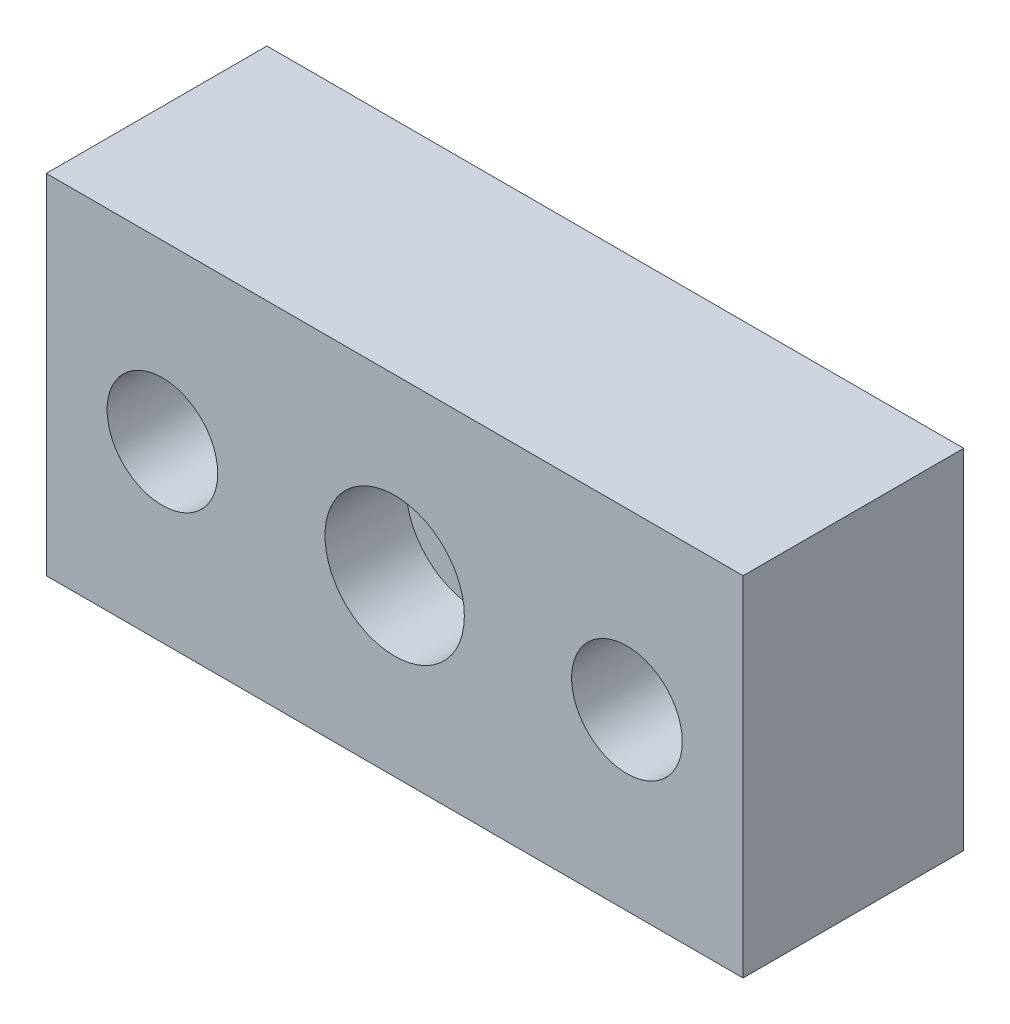
ISO-10303-21;
HEADER;
FILE_DESCRIPTION(('STEP AP214'),'2;1');
FILE_NAME('part.step','',(''),(''),'','','');
FILE_SCHEMA(('AUTOMOTIVE_DESIGN { 1 0 10303 214 1 1 1 1 }'));
ENDSEC;
DATA;
#1=APPLICATION_CONTEXT('core data for automotive mechanical design processes');
#2=APPLICATION_PROTOCOL_DEFINITION('international standard','automotive_design',2000,#1);
#3=PRODUCT_CONTEXT('',#1,'mechanical');
#4=PRODUCT('Part','Part','',(#3));
#5=PRODUCT_RELATED_PRODUCT_CATEGORY('part','',(#4));
#6=PRODUCT_DEFINITION_FORMATION('','',#4);
#7=PRODUCT_DEFINITION_CONTEXT('part definition',#1,'design');
#8=PRODUCT_DEFINITION('design','',#6,#7);
#9=PRODUCT_DEFINITION_SHAPE('','',#8);
#10=(LENGTH_UNIT() NAMED_UNIT(*) SI_UNIT(.MILLI.,.METRE.));
#11=(NAMED_UNIT(*) PLANE_ANGLE_UNIT() SI_UNIT($,.RADIAN.));
#12=(NAMED_UNIT(*) SI_UNIT($,.STERADIAN.) SOLID_ANGLE_UNIT());
#13=UNCERTAINTY_MEASURE_WITH_UNIT(LENGTH_MEASURE(1.E-05),#10,'distance_accuracy_value','');
#14=(GEOMETRIC_REPRESENTATION_CONTEXT(3) GLOBAL_UNCERTAINTY_ASSIGNED_CONTEXT((#13)) GLOBAL_UNIT_ASSIGNED_CONTEXT((#10,
#11,#12)) REPRESENTATION_CONTEXT('',''));
#15=CARTESIAN_POINT('',(0.,0.,0.));
#16=DIRECTION('',(0.,0.,1.));
#17=DIRECTION('',(1.,0.,0.));
#18=AXIS2_PLACEMENT_3D('',#15,#16,#17);
#19=CARTESIAN_POINT('',(0.,0.,9.5));
#20=DIRECTION('',(0.,0.,-1.));
#21=DIRECTION('',(-1.,0.,0.));
#22=AXIS2_PLACEMENT_3D('',#19,#20,#21);
#23=CYLINDRICAL_SURFACE('',#22,1.);
#24=CARTESIAN_POINT('',(0.,0.,6.));
#25=DIRECTION('',(0.,0.,1.));
#26=DIRECTION('',(1.,0.,0.));
#27=AXIS2_PLACEMENT_3D('',#24,#25,#26);
#28=CIRCLE('',#27,1.);
#29=CARTESIAN_POINT('',(0.999999999999993,0.,6.));
#30=VERTEX_POINT('',#29);
#31=EDGE_CURVE('E126',#30,#30,#28,.T.);
#32=ORIENTED_EDGE('',*,*,#31,.T.);
#33=EDGE_LOOP('',(#32));
#34=FACE_BOUND('',#33,.T.);
#35=CARTESIAN_POINT('',(0.,0.,3.));
#36=DIRECTION('',(0.,0.,-1.));
#37=DIRECTION('',(-1.,0.,0.));
#38=AXIS2_PLACEMENT_3D('',#35,#36,#37);
#39=CIRCLE('',#38,1.);
#40=CARTESIAN_POINT('',(-1.00000000000001,0.,3.));
#41=VERTEX_POINT('',#40);
#42=EDGE_CURVE('E43',#41,#41,#39,.T.);
#43=ORIENTED_EDGE('',*,*,#42,.T.);
#44=EDGE_LOOP('',(#43));
#45=FACE_BOUND('',#44,.T.);
#46=ADVANCED_FACE('F39',(#34,#45),#23,.F.);
#47=CARTESIAN_POINT('',(0.,0.,9.5));
#48=DIRECTION('',(0.,0.,-1.));
#49=DIRECTION('',(-1.,0.,0.));
#50=AXIS2_PLACEMENT_3D('',#47,#48,#49);
#51=PLANE('',#50);
#52=CARTESIAN_POINT('',(0.,0.,9.5));
#53=DIRECTION('',(0.,0.,1.));
#54=DIRECTION('',(1.,0.,0.));
#55=AXIS2_PLACEMENT_3D('',#52,#53,#54);
#56=CIRCLE('',#55,3.);
#57=CARTESIAN_POINT('',(3.,0.,9.5));
#58=VERTEX_POINT('',#57);
#59=EDGE_CURVE('E139',#58,#58,#56,.T.);
#60=ORIENTED_EDGE('',*,*,#59,.F.);
#61=EDGE_LOOP('',(#60));
#62=FACE_BOUND('',#61,.T.);
#63=DIRECTION('',(0.,1.,0.));
#64=VECTOR('',#63,1.);
#65=CARTESIAN_POINT('',(15.,-7.5,9.5));
#66=LINE('',#65,#64);
#67=CARTESIAN_POINT('',(15.,-7.5,9.5));
#68=VERTEX_POINT('',#67);
#69=CARTESIAN_POINT('',(15.,7.5,9.5));
#70=VERTEX_POINT('',#69);
#71=EDGE_CURVE('E95',#68,#70,#66,.T.);
#72=ORIENTED_EDGE('',*,*,#71,.T.);
#73=DIRECTION('',(-1.,0.,0.));
#74=VECTOR('',#73,1.);
#75=CARTESIAN_POINT('',(-15.,7.5,9.5));
#76=LINE('',#75,#74);
#77=CARTESIAN_POINT('',(-15.,7.5,9.5));
#78=VERTEX_POINT('',#77);
#79=EDGE_CURVE('E89',#70,#78,#76,.T.);
#80=ORIENTED_EDGE('',*,*,#79,.T.);
#81=DIRECTION('',(0.,-1.,0.));
#82=VECTOR('',#81,1.);
#83=CARTESIAN_POINT('',(-15.,-7.5,9.5));
#84=LINE('',#83,#82);
#85=CARTESIAN_POINT('',(-15.,-7.5,9.5));
#86=VERTEX_POINT('',#85);
#87=EDGE_CURVE('E93',#78,#86,#84,.T.);
#88=ORIENTED_EDGE('',*,*,#87,.T.);
#89=DIRECTION('',(1.,0.,0.));
#90=VECTOR('',#89,1.);
#91=CARTESIAN_POINT('',(-15.,-7.5,9.5));
#92=LINE('',#91,#90);
#93=EDGE_CURVE('E59',#86,#68,#92,.T.);
#94=ORIENTED_EDGE('',*,*,#93,.T.);
#95=EDGE_LOOP('',(#72,#80,#88,#94));
#96=FACE_BOUND('',#95,.T.);
#97=CARTESIAN_POINT('',(10.,0.,9.5));
#98=DIRECTION('',(0.,0.,1.));
#99=DIRECTION('',(1.,0.,0.));
#100=AXIS2_PLACEMENT_3D('',#97,#98,#99);
#101=CIRCLE('',#100,2.38125);
#102=CARTESIAN_POINT('',(12.38125,0.,9.5));
#103=VERTEX_POINT('',#102);
#104=EDGE_CURVE('E116',#103,#103,#101,.T.);
#105=ORIENTED_EDGE('',*,*,#104,.F.);
#106=EDGE_LOOP('',(#105));
#107=FACE_BOUND('',#106,.T.);
#108=CARTESIAN_POINT('',(-10.,0.,9.5));
#109=DIRECTION('',(0.,0.,1.));
#110=DIRECTION('',(1.,0.,0.));
#111=AXIS2_PLACEMENT_3D('',#108,#109,#110);
#112=CIRCLE('',#111,2.38125);
#113=CARTESIAN_POINT('',(-7.61875,0.,9.5));
#114=VERTEX_POINT('',#113);
#115=EDGE_CURVE('E136',#114,#114,#112,.T.);
#116=ORIENTED_EDGE('',*,*,#115,.F.);
#117=EDGE_LOOP('',(#116));
#118=FACE_BOUND('',#117,.T.);
#119=ADVANCED_FACE('F90',(#62,#96,#107,#118),#51,.F.);
#120=CARTESIAN_POINT('',(0.,0.,0.));
#121=DIRECTION('',(0.,0.,-1.));
#122=DIRECTION('',(-1.,0.,0.));
#123=AXIS2_PLACEMENT_3D('',#120,#121,#122);
#124=PLANE('',#123);
#125=CARTESIAN_POINT('',(0.,0.,0.));
#126=DIRECTION('',(0.,0.,-1.));
#127=DIRECTION('',(-1.,0.,0.));
#128=AXIS2_PLACEMENT_3D('',#125,#126,#127);
#129=CIRCLE('',#128,3.);
#130=CARTESIAN_POINT('',(-3.,0.,0.));
#131=VERTEX_POINT('',#130);
#132=EDGE_CURVE('E147',#131,#131,#129,.T.);
#133=ORIENTED_EDGE('',*,*,#132,.F.);
#134=EDGE_LOOP('',(#133));
#135=FACE_BOUND('',#134,.T.);
#136=CARTESIAN_POINT('',(10.,0.,0.));
#137=DIRECTION('',(0.,0.,1.));
#138=DIRECTION('',(1.,0.,0.));
#139=AXIS2_PLACEMENT_3D('',#136,#137,#138);
#140=CIRCLE('',#139,2.38125);
#141=CARTESIAN_POINT('',(12.38125,0.,0.));
#142=VERTEX_POINT('',#141);
#143=EDGE_CURVE('E152',#142,#142,#140,.T.);
#144=ORIENTED_EDGE('',*,*,#143,.T.);
#145=EDGE_LOOP('',(#144));
#146=FACE_BOUND('',#145,.T.);
#147=DIRECTION('',(0.,1.,0.));
#148=VECTOR('',#147,1.);
#149=CARTESIAN_POINT('',(15.,-7.5,0.));
#150=LINE('',#149,#148);
#151=CARTESIAN_POINT('',(15.,-7.5,0.));
#152=VERTEX_POINT('',#151);
#153=CARTESIAN_POINT('',(15.,7.5,0.));
#154=VERTEX_POINT('',#153);
#155=EDGE_CURVE('E112',#152,#154,#150,.T.);
#156=ORIENTED_EDGE('',*,*,#155,.F.);
#157=DIRECTION('',(1.,0.,0.));
#158=VECTOR('',#157,1.);
#159=CARTESIAN_POINT('',(-15.,-7.5,0.));
#160=LINE('',#159,#158);
#161=CARTESIAN_POINT('',(-15.,-7.5,0.));
#162=VERTEX_POINT('',#161);
#163=EDGE_CURVE('E82',#162,#152,#160,.T.);
#164=ORIENTED_EDGE('',*,*,#163,.F.);
#165=DIRECTION('',(0.,-1.,0.));
#166=VECTOR('',#165,1.);
#167=CARTESIAN_POINT('',(-15.,-7.5,0.));
#168=LINE('',#167,#166);
#169=CARTESIAN_POINT('',(-15.,7.5,0.));
#170=VERTEX_POINT('',#169);
#171=EDGE_CURVE('E76',#170,#162,#168,.T.);
#172=ORIENTED_EDGE('',*,*,#171,.F.);
#173=DIRECTION('',(-1.,0.,0.));
#174=VECTOR('',#173,1.);
#175=CARTESIAN_POINT('',(-15.,7.5,0.));
#176=LINE('',#175,#174);
#177=EDGE_CURVE('E100',#154,#170,#176,.T.);
#178=ORIENTED_EDGE('',*,*,#177,.F.);
#179=EDGE_LOOP('',(#156,#164,#172,#178));
#180=FACE_BOUND('',#179,.T.);
#181=CARTESIAN_POINT('',(-10.,0.,0.));
#182=DIRECTION('',(0.,0.,1.));
#183=DIRECTION('',(1.,0.,0.));
#184=AXIS2_PLACEMENT_3D('',#181,#182,#183);
#185=CIRCLE('',#184,2.38125);
#186=CARTESIAN_POINT('',(-7.61875,0.,0.));
#187=VERTEX_POINT('',#186);
#188=EDGE_CURVE('E129',#187,#187,#185,.T.);
#189=ORIENTED_EDGE('',*,*,#188,.T.);
#190=EDGE_LOOP('',(#189));
#191=FACE_BOUND('',#190,.T.);
#192=ADVANCED_FACE('F162',(#135,#146,#180,#191),#124,.T.);
#193=CARTESIAN_POINT('',(15.,-7.5,9.5));
#194=DIRECTION('',(-1.,0.,0.));
#195=DIRECTION('',(0.,0.,1.));
#196=AXIS2_PLACEMENT_3D('',#193,#194,#195);
#197=PLANE('',#196);
#198=ORIENTED_EDGE('',*,*,#155,.T.);
#199=DIRECTION('',(0.,0.,-1.));
#200=VECTOR('',#199,1.);
#201=CARTESIAN_POINT('',(15.,7.5,9.5));
#202=LINE('',#201,#200);
#203=EDGE_CURVE('E11',#70,#154,#202,.T.);
#204=ORIENTED_EDGE('',*,*,#203,.F.);
#205=ORIENTED_EDGE('',*,*,#71,.F.);
#206=DIRECTION('',(0.,0.,-1.));
#207=VECTOR('',#206,1.);
#208=CARTESIAN_POINT('',(15.,-7.5,9.5));
#209=LINE('',#208,#207);
#210=EDGE_CURVE('E108',#68,#152,#209,.T.);
#211=ORIENTED_EDGE('',*,*,#210,.T.);
#212=EDGE_LOOP('',(#198,#204,#205,#211));
#213=FACE_BOUND('',#212,.T.);
#214=ADVANCED_FACE('F41',(#213),#197,.F.);
#215=CARTESIAN_POINT('',(-15.,7.5,9.5));
#216=DIRECTION('',(0.,-1.,0.));
#217=DIRECTION('',(0.,0.,-1.));
#218=AXIS2_PLACEMENT_3D('',#215,#216,#217);
#219=PLANE('',#218);
#220=ORIENTED_EDGE('',*,*,#177,.T.);
#221=DIRECTION('',(0.,0.,-1.));
#222=VECTOR('',#221,1.);
#223=CARTESIAN_POINT('',(-15.,7.5,9.5));
#224=LINE('',#223,#222);
#225=EDGE_CURVE('E50',#78,#170,#224,.T.);
#226=ORIENTED_EDGE('',*,*,#225,.F.);
#227=ORIENTED_EDGE('',*,*,#79,.F.);
#228=ORIENTED_EDGE('',*,*,#203,.T.);
#229=EDGE_LOOP('',(#220,#226,#227,#228));
#230=FACE_BOUND('',#229,.T.);
#231=ADVANCED_FACE('F99',(#230),#219,.F.);
#232=CARTESIAN_POINT('',(-15.,-7.5,9.5));
#233=DIRECTION('',(1.,0.,0.));
#234=DIRECTION('',(0.,0.,-1.));
#235=AXIS2_PLACEMENT_3D('',#232,#233,#234);
#236=PLANE('',#235);
#237=ORIENTED_EDGE('',*,*,#171,.T.);
#238=DIRECTION('',(0.,0.,-1.));
#239=VECTOR('',#238,1.);
#240=CARTESIAN_POINT('',(-15.,-7.5,9.5));
#241=LINE('',#240,#239);
#242=EDGE_CURVE('E102',#86,#162,#241,.T.);
#243=ORIENTED_EDGE('',*,*,#242,.F.);
#244=ORIENTED_EDGE('',*,*,#87,.F.);
#245=ORIENTED_EDGE('',*,*,#225,.T.);
#246=EDGE_LOOP('',(#237,#243,#244,#245));
#247=FACE_BOUND('',#246,.T.);
#248=ADVANCED_FACE('F104',(#247),#236,.F.);
#249=CARTESIAN_POINT('',(-15.,-7.5,9.5));
#250=DIRECTION('',(0.,1.,0.));
#251=DIRECTION('',(0.,0.,1.));
#252=AXIS2_PLACEMENT_3D('',#249,#250,#251);
#253=PLANE('',#252);
#254=ORIENTED_EDGE('',*,*,#163,.T.);
#255=ORIENTED_EDGE('',*,*,#210,.F.);
#256=ORIENTED_EDGE('',*,*,#93,.F.);
#257=ORIENTED_EDGE('',*,*,#242,.T.);
#258=EDGE_LOOP('',(#254,#255,#256,#257));
#259=FACE_BOUND('',#258,.T.);
#260=ADVANCED_FACE('F168',(#259),#253,.F.);
#261=CARTESIAN_POINT('',(10.,0.,9.5));
#262=DIRECTION('',(0.,0.,-1.));
#263=DIRECTION('',(-1.,0.,0.));
#264=AXIS2_PLACEMENT_3D('',#261,#262,#263);
#265=CYLINDRICAL_SURFACE('',#264,2.38125);
#266=ORIENTED_EDGE('',*,*,#104,.T.);
#267=EDGE_LOOP('',(#266));
#268=FACE_BOUND('',#267,.T.);
#269=ORIENTED_EDGE('',*,*,#143,.F.);
#270=EDGE_LOOP('',(#269));
#271=FACE_BOUND('',#270,.T.);
#272=ADVANCED_FACE('F165',(#268,#271),#265,.F.);
#273=CARTESIAN_POINT('',(-10.,0.,9.5));
#274=DIRECTION('',(0.,0.,-1.));
#275=DIRECTION('',(-1.,0.,0.));
#276=AXIS2_PLACEMENT_3D('',#273,#274,#275);
#277=CYLINDRICAL_SURFACE('',#276,2.38125);
#278=ORIENTED_EDGE('',*,*,#115,.T.);
#279=EDGE_LOOP('',(#278));
#280=FACE_BOUND('',#279,.T.);
#281=ORIENTED_EDGE('',*,*,#188,.F.);
#282=EDGE_LOOP('',(#281));
#283=FACE_BOUND('',#282,.T.);
#284=ADVANCED_FACE('F167',(#280,#283),#277,.F.);
#285=CARTESIAN_POINT('',(0.,0.,6.));
#286=DIRECTION('',(0.,0.,1.));
#287=DIRECTION('',(1.,0.,0.));
#288=AXIS2_PLACEMENT_3D('',#285,#286,#287);
#289=CYLINDRICAL_SURFACE('',#288,3.);
#290=CARTESIAN_POINT('',(0.,0.,6.));
#291=DIRECTION('',(0.,0.,1.));
#292=DIRECTION('',(1.,0.,0.));
#293=AXIS2_PLACEMENT_3D('',#290,#291,#292);
#294=CIRCLE('',#293,3.);
#295=CARTESIAN_POINT('',(3.,0.,6.));
#296=VERTEX_POINT('',#295);
#297=EDGE_CURVE('E130',#296,#296,#294,.T.);
#298=ORIENTED_EDGE('',*,*,#297,.F.);
#299=EDGE_LOOP('',(#298));
#300=FACE_BOUND('',#299,.T.);
#301=ORIENTED_EDGE('',*,*,#59,.T.);
#302=EDGE_LOOP('',(#301));
#303=FACE_BOUND('',#302,.T.);
#304=ADVANCED_FACE('F175',(#300,#303),#289,.F.);
#305=CARTESIAN_POINT('',(0.,0.,6.));
#306=DIRECTION('',(0.,0.,1.));
#307=DIRECTION('',(1.,0.,0.));
#308=AXIS2_PLACEMENT_3D('',#305,#306,#307);
#309=PLANE('',#308);
#310=ORIENTED_EDGE('',*,*,#31,.F.);
#311=EDGE_LOOP('',(#310));
#312=FACE_BOUND('',#311,.T.);
#313=ORIENTED_EDGE('',*,*,#297,.T.);
#314=EDGE_LOOP('',(#313));
#315=FACE_BOUND('',#314,.T.);
#316=ADVANCED_FACE('F224',(#312,#315),#309,.T.);
#317=CARTESIAN_POINT('',(0.,0.,3.));
#318=DIRECTION('',(0.,0.,-1.));
#319=DIRECTION('',(-1.,0.,0.));
#320=AXIS2_PLACEMENT_3D('',#317,#318,#319);
#321=CYLINDRICAL_SURFACE('',#320,3.);
#322=CARTESIAN_POINT('',(0.,0.,3.));
#323=DIRECTION('',(0.,0.,-1.));
#324=DIRECTION('',(-1.,0.,0.));
#325=AXIS2_PLACEMENT_3D('',#322,#323,#324);
#326=CIRCLE('',#325,3.);
#327=CARTESIAN_POINT('',(-3.,0.,3.));
#328=VERTEX_POINT('',#327);
#329=EDGE_CURVE('E266',#328,#328,#326,.T.);
#330=ORIENTED_EDGE('',*,*,#329,.F.);
#331=EDGE_LOOP('',(#330));
#332=FACE_BOUND('',#331,.T.);
#333=ORIENTED_EDGE('',*,*,#132,.T.);
#334=EDGE_LOOP('',(#333));
#335=FACE_BOUND('',#334,.T.);
#336=ADVANCED_FACE('F233',(#332,#335),#321,.F.);
#337=CARTESIAN_POINT('',(0.,0.,3.));
#338=DIRECTION('',(0.,0.,-1.));
#339=DIRECTION('',(-1.,0.,0.));
#340=AXIS2_PLACEMENT_3D('',#337,#338,#339);
#341=PLANE('',#340);
#342=ORIENTED_EDGE('',*,*,#42,.F.);
#343=EDGE_LOOP('',(#342));
#344=FACE_BOUND('',#343,.T.);
#345=ORIENTED_EDGE('',*,*,#329,.T.);
#346=EDGE_LOOP('',(#345));
#347=FACE_BOUND('',#346,.T.);
#348=ADVANCED_FACE('F248',(#344,#347),#341,.T.);
#349=CLOSED_SHELL('',(#46,#119,#192,#214,#231,#248,#260,#272,#284,#304,#316,#336,#348));
#350=MANIFOLD_SOLID_BREP('B2',#349);
#351=ADVANCED_BREP_SHAPE_REPRESENTATION('',(#18,#350),#14);
#352=SHAPE_DEFINITION_REPRESENTATION(#9,#351);
ENDSEC;
END-ISO-10303-21;
